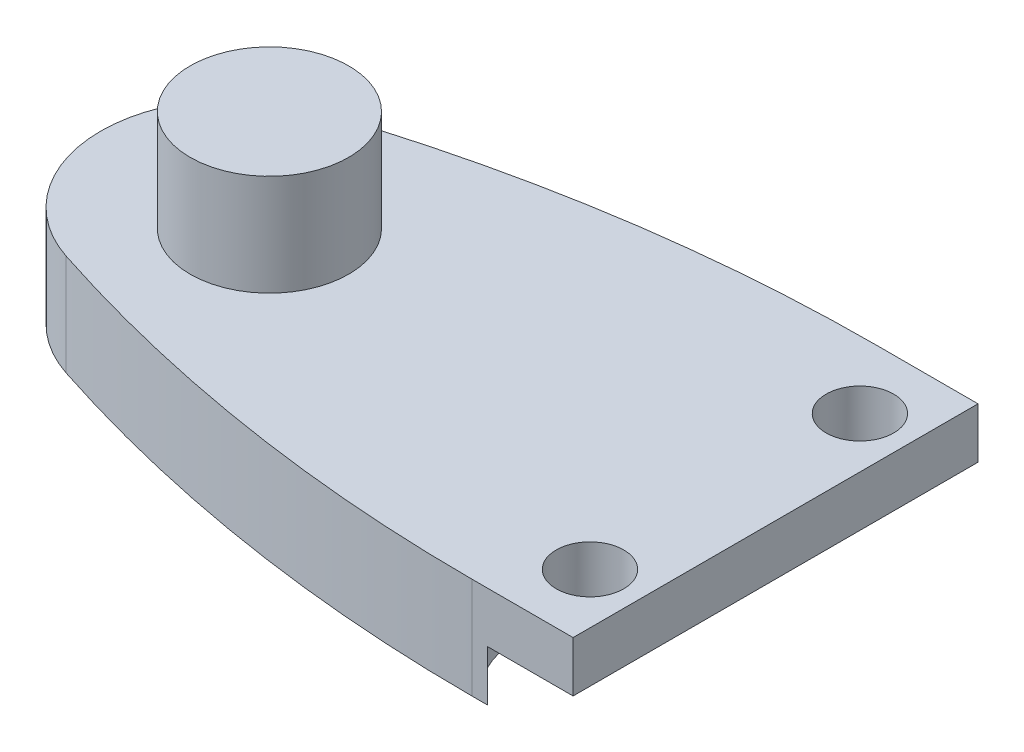
ISO-10303-21;
HEADER;
FILE_DESCRIPTION(('STEP AP214'),'2;1');
FILE_NAME('part.step','',(''),(''),'','','');
FILE_SCHEMA(('AUTOMOTIVE_DESIGN { 1 0 10303 214 1 1 1 1 }'));
ENDSEC;
DATA;
#1=APPLICATION_CONTEXT('core data for automotive mechanical design processes');
#2=APPLICATION_PROTOCOL_DEFINITION('international standard','automotive_design',2000,#1);
#3=PRODUCT_CONTEXT('',#1,'mechanical');
#4=PRODUCT('Part','Part','',(#3));
#5=PRODUCT_RELATED_PRODUCT_CATEGORY('part','',(#4));
#6=PRODUCT_DEFINITION_FORMATION('','',#4);
#7=PRODUCT_DEFINITION_CONTEXT('part definition',#1,'design');
#8=PRODUCT_DEFINITION('design','',#6,#7);
#9=PRODUCT_DEFINITION_SHAPE('','',#8);
#10=(LENGTH_UNIT() NAMED_UNIT(*) SI_UNIT(.MILLI.,.METRE.));
#11=(NAMED_UNIT(*) PLANE_ANGLE_UNIT() SI_UNIT($,.RADIAN.));
#12=(NAMED_UNIT(*) SI_UNIT($,.STERADIAN.) SOLID_ANGLE_UNIT());
#13=UNCERTAINTY_MEASURE_WITH_UNIT(LENGTH_MEASURE(1.E-05),#10,'distance_accuracy_value','');
#14=(GEOMETRIC_REPRESENTATION_CONTEXT(3) GLOBAL_UNCERTAINTY_ASSIGNED_CONTEXT((#13)) GLOBAL_UNIT_ASSIGNED_CONTEXT((#10,
#11,#12)) REPRESENTATION_CONTEXT('',''));
#15=CARTESIAN_POINT('',(0.,0.,0.));
#16=DIRECTION('',(0.,0.,1.));
#17=DIRECTION('',(1.,0.,0.));
#18=AXIS2_PLACEMENT_3D('',#15,#16,#17);
#19=CARTESIAN_POINT('',(15.,-3.,0.));
#20=DIRECTION('',(-1.,0.,0.));
#21=DIRECTION('',(0.,0.,1.));
#22=AXIS2_PLACEMENT_3D('',#19,#20,#21);
#23=PLANE('',#22);
#24=DIRECTION('',(0.,0.,1.));
#25=VECTOR('',#24,1.);
#26=CARTESIAN_POINT('',(15.,-1.5,0.));
#27=LINE('',#26,#25);
#28=CARTESIAN_POINT('',(15.,-1.5,-6.));
#29=VERTEX_POINT('',#28);
#30=CARTESIAN_POINT('',(15.,-1.5,6.));
#31=VERTEX_POINT('',#30);
#32=EDGE_CURVE('E154',#29,#31,#27,.T.);
#33=ORIENTED_EDGE('',*,*,#32,.F.);
#34=DIRECTION('',(0.,1.,0.));
#35=VECTOR('',#34,1.);
#36=CARTESIAN_POINT('',(15.,-3.,-6.));
#37=LINE('',#36,#35);
#38=CARTESIAN_POINT('',(15.,0.,-6.));
#39=VERTEX_POINT('',#38);
#40=EDGE_CURVE('E44',#29,#39,#37,.T.);
#41=ORIENTED_EDGE('',*,*,#40,.T.);
#42=DIRECTION('',(0.,0.,1.));
#43=VECTOR('',#42,1.);
#44=CARTESIAN_POINT('',(15.,0.,0.));
#45=LINE('',#44,#43);
#46=CARTESIAN_POINT('',(15.,0.,6.));
#47=VERTEX_POINT('',#46);
#48=EDGE_CURVE('E200',#39,#47,#45,.T.);
#49=ORIENTED_EDGE('',*,*,#48,.T.);
#50=DIRECTION('',(0.,1.,0.));
#51=VECTOR('',#50,1.);
#52=CARTESIAN_POINT('',(15.,-3.,6.));
#53=LINE('',#52,#51);
#54=EDGE_CURVE('E205',#31,#47,#53,.T.);
#55=ORIENTED_EDGE('',*,*,#54,.F.);
#56=EDGE_LOOP('',(#33,#41,#49,#55));
#57=FACE_BOUND('',#56,.T.);
#58=ADVANCED_FACE('F35',(#57),#23,.F.);
#59=CARTESIAN_POINT('',(13.5,-10.,4.));
#60=DIRECTION('',(0.,1.,0.));
#61=DIRECTION('',(0.,0.,1.));
#62=AXIS2_PLACEMENT_3D('',#59,#60,#61);
#63=CYLINDRICAL_SURFACE('',#62,1.);
#64=CARTESIAN_POINT('',(13.5,0.,4.));
#65=DIRECTION('',(0.,1.,0.));
#66=DIRECTION('',(0.,0.,1.));
#67=AXIS2_PLACEMENT_3D('',#64,#65,#66);
#68=CIRCLE('',#67,1.);
#69=CARTESIAN_POINT('',(13.5,0.,5.));
#70=VERTEX_POINT('',#69);
#71=EDGE_CURVE('E166',#70,#70,#68,.T.);
#72=ORIENTED_EDGE('',*,*,#71,.T.);
#73=EDGE_LOOP('',(#72));
#74=FACE_BOUND('',#73,.T.);
#75=CARTESIAN_POINT('',(13.5,-1.5,4.));
#76=DIRECTION('',(0.,-1.,0.));
#77=DIRECTION('',(0.,0.,-1.));
#78=AXIS2_PLACEMENT_3D('',#75,#76,#77);
#79=CIRCLE('',#78,1.);
#80=CARTESIAN_POINT('',(13.5,-1.5,3.));
#81=VERTEX_POINT('',#80);
#82=EDGE_CURVE('E150',#81,#81,#79,.F.);
#83=ORIENTED_EDGE('',*,*,#82,.F.);
#84=EDGE_LOOP('',(#83));
#85=FACE_BOUND('',#84,.T.);
#86=ADVANCED_FACE('F244',(#74,#85),#63,.F.);
#87=CARTESIAN_POINT('',(13.5,-10.,-4.));
#88=DIRECTION('',(0.,1.,0.));
#89=DIRECTION('',(0.,0.,1.));
#90=AXIS2_PLACEMENT_3D('',#87,#88,#89);
#91=CYLINDRICAL_SURFACE('',#90,1.);
#92=CARTESIAN_POINT('',(13.5,0.,-4.));
#93=DIRECTION('',(0.,1.,0.));
#94=DIRECTION('',(0.,0.,1.));
#95=AXIS2_PLACEMENT_3D('',#92,#93,#94);
#96=CIRCLE('',#95,1.);
#97=CARTESIAN_POINT('',(13.5,0.,-3.));
#98=VERTEX_POINT('',#97);
#99=EDGE_CURVE('E163',#98,#98,#96,.T.);
#100=ORIENTED_EDGE('',*,*,#99,.T.);
#101=EDGE_LOOP('',(#100));
#102=FACE_BOUND('',#101,.T.);
#103=CARTESIAN_POINT('',(13.5,-1.5,-4.));
#104=DIRECTION('',(0.,-1.,0.));
#105=DIRECTION('',(0.,0.,-1.));
#106=AXIS2_PLACEMENT_3D('',#103,#104,#105);
#107=CIRCLE('',#106,1.);
#108=CARTESIAN_POINT('',(13.5,-1.5,-5.));
#109=VERTEX_POINT('',#108);
#110=EDGE_CURVE('E39',#109,#109,#107,.F.);
#111=ORIENTED_EDGE('',*,*,#110,.F.);
#112=EDGE_LOOP('',(#111));
#113=FACE_BOUND('',#112,.T.);
#114=ADVANCED_FACE('F249',(#102,#113),#91,.F.);
#115=CARTESIAN_POINT('',(0.,0.,0.));
#116=DIRECTION('',(0.,1.,0.));
#117=DIRECTION('',(0.,0.,1.));
#118=AXIS2_PLACEMENT_3D('',#115,#116,#117);
#119=PLANE('',#118);
#120=ORIENTED_EDGE('',*,*,#99,.F.);
#121=EDGE_LOOP('',(#120));
#122=FACE_BOUND('',#121,.T.);
#123=ORIENTED_EDGE('',*,*,#71,.F.);
#124=EDGE_LOOP('',(#123));
#125=FACE_BOUND('',#124,.T.);
#126=CARTESIAN_POINT('',(12.,0.,40.0379964002251));
#127=DIRECTION('',(0.,1.,0.));
#128=DIRECTION('',(0.,0.,1.));
#129=AXIS2_PLACEMENT_3D('',#126,#127,#128);
#130=CIRCLE('',#129,46.0379964002251);
#131=CARTESIAN_POINT('',(12.,0.,-6.));
#132=VERTEX_POINT('',#131);
#133=CARTESIAN_POINT('',(-2.29999999999999,0.,-3.72279784013507));
#134=VERTEX_POINT('',#133);
#135=EDGE_CURVE('E173',#132,#134,#130,.T.);
#136=ORIENTED_EDGE('',*,*,#135,.T.);
#137=CARTESIAN_POINT('',(-1.08347708175661,0.,0.));
#138=DIRECTION('',(0.,1.,0.));
#139=DIRECTION('',(0.,0.,1.));
#140=AXIS2_PLACEMENT_3D('',#137,#138,#139);
#141=CIRCLE('',#140,3.91652291824339);
#142=CARTESIAN_POINT('',(-2.29999999999999,0.,3.72279784013507));
#143=VERTEX_POINT('',#142);
#144=EDGE_CURVE('E191',#134,#143,#141,.T.);
#145=ORIENTED_EDGE('',*,*,#144,.T.);
#146=CARTESIAN_POINT('',(12.,0.,-40.0379964002251));
#147=DIRECTION('',(0.,1.,0.));
#148=DIRECTION('',(0.,0.,1.));
#149=AXIS2_PLACEMENT_3D('',#146,#147,#148);
#150=CIRCLE('',#149,46.0379964002251);
#151=CARTESIAN_POINT('',(12.,0.,6.));
#152=VERTEX_POINT('',#151);
#153=EDGE_CURVE('E194',#152,#143,#150,.F.);
#154=ORIENTED_EDGE('',*,*,#153,.F.);
#155=DIRECTION('',(1.,0.,0.));
#156=VECTOR('',#155,1.);
#157=CARTESIAN_POINT('',(0.,0.,6.));
#158=LINE('',#157,#156);
#159=EDGE_CURVE('E197',#152,#47,#158,.T.);
#160=ORIENTED_EDGE('',*,*,#159,.T.);
#161=ORIENTED_EDGE('',*,*,#48,.F.);
#162=DIRECTION('',(1.,0.,0.));
#163=VECTOR('',#162,1.);
#164=CARTESIAN_POINT('',(0.,0.,-6.));
#165=LINE('',#164,#163);
#166=EDGE_CURVE('E179',#132,#39,#165,.T.);
#167=ORIENTED_EDGE('',*,*,#166,.F.);
#168=EDGE_LOOP('',(#136,#145,#154,#160,#161,#167));
#169=FACE_BOUND('',#168,.T.);
#170=CARTESIAN_POINT('',(0.,0.,0.));
#171=DIRECTION('',(0.,1.,0.));
#172=DIRECTION('',(0.,0.,1.));
#173=AXIS2_PLACEMENT_3D('',#170,#171,#172);
#174=CIRCLE('',#173,2.35);
#175=CARTESIAN_POINT('',(0.,0.,2.35));
#176=VERTEX_POINT('',#175);
#177=EDGE_CURVE('E169',#176,#176,#174,.T.);
#178=ORIENTED_EDGE('',*,*,#177,.F.);
#179=EDGE_LOOP('',(#178));
#180=FACE_BOUND('',#179,.T.);
#181=ADVANCED_FACE('F215',(#122,#125,#169,#180),#119,.T.);
#182=CARTESIAN_POINT('',(12.,-3.,40.0379964002251));
#183=DIRECTION('',(0.,1.,0.));
#184=DIRECTION('',(0.,0.,1.));
#185=AXIS2_PLACEMENT_3D('',#182,#183,#184);
#186=CYLINDRICAL_SURFACE('',#185,46.0379964002251);
#187=ORIENTED_EDGE('',*,*,#135,.F.);
#188=DIRECTION('',(0.,1.,0.));
#189=VECTOR('',#188,1.);
#190=CARTESIAN_POINT('',(12.,-3.,-6.));
#191=LINE('',#190,#189);
#192=CARTESIAN_POINT('',(12.,-3.,-6.));
#193=VERTEX_POINT('',#192);
#194=EDGE_CURVE('E11',#193,#132,#191,.T.);
#195=ORIENTED_EDGE('',*,*,#194,.F.);
#196=CARTESIAN_POINT('',(12.,-3.,40.0379964002251));
#197=DIRECTION('',(0.,1.,0.));
#198=DIRECTION('',(0.,0.,1.));
#199=AXIS2_PLACEMENT_3D('',#196,#197,#198);
#200=CIRCLE('',#199,46.0379964002251);
#201=CARTESIAN_POINT('',(-2.29999999999999,-3.,-3.72279784013507));
#202=VERTEX_POINT('',#201);
#203=EDGE_CURVE('E176',#193,#202,#200,.T.);
#204=ORIENTED_EDGE('',*,*,#203,.T.);
#205=DIRECTION('',(0.,1.,0.));
#206=VECTOR('',#205,1.);
#207=CARTESIAN_POINT('',(-2.29999999999999,-3.,-3.72279784013507));
#208=LINE('',#207,#206);
#209=EDGE_CURVE('E91',#202,#134,#208,.T.);
#210=ORIENTED_EDGE('',*,*,#209,.T.);
#211=EDGE_LOOP('',(#187,#195,#204,#210));
#212=FACE_BOUND('',#211,.T.);
#213=ADVANCED_FACE('F37',(#212),#186,.T.);
#214=CARTESIAN_POINT('',(0.,-3.,-6.));
#215=DIRECTION('',(0.,0.,1.));
#216=DIRECTION('',(1.,0.,0.));
#217=AXIS2_PLACEMENT_3D('',#214,#215,#216);
#218=PLANE('',#217);
#219=DIRECTION('',(1.,0.,0.));
#220=VECTOR('',#219,1.);
#221=CARTESIAN_POINT('',(0.,-1.5,-6.));
#222=LINE('',#221,#220);
#223=CARTESIAN_POINT('',(12.4692235935956,-1.5,-6.));
#224=VERTEX_POINT('',#223);
#225=EDGE_CURVE('E156',#224,#29,#222,.T.);
#226=ORIENTED_EDGE('',*,*,#225,.F.);
#227=DIRECTION('',(0.,-1.,0.));
#228=VECTOR('',#227,1.);
#229=CARTESIAN_POINT('',(12.4692235935956,-1.5,-6.));
#230=LINE('',#229,#228);
#231=CARTESIAN_POINT('',(12.4692235935956,-3.,-6.));
#232=VERTEX_POINT('',#231);
#233=EDGE_CURVE('E158',#224,#232,#230,.T.);
#234=ORIENTED_EDGE('',*,*,#233,.T.);
#235=DIRECTION('',(1.,0.,0.));
#236=VECTOR('',#235,1.);
#237=CARTESIAN_POINT('',(0.,-3.,-6.));
#238=LINE('',#237,#236);
#239=EDGE_CURVE('E186',#193,#232,#238,.T.);
#240=ORIENTED_EDGE('',*,*,#239,.F.);
#241=ORIENTED_EDGE('',*,*,#194,.T.);
#242=ORIENTED_EDGE('',*,*,#166,.T.);
#243=ORIENTED_EDGE('',*,*,#40,.F.);
#244=EDGE_LOOP('',(#226,#234,#240,#241,#242,#243));
#245=FACE_BOUND('',#244,.T.);
#246=ADVANCED_FACE('F220',(#245),#218,.F.);
#247=CARTESIAN_POINT('',(0.,-3.,6.));
#248=DIRECTION('',(0.,0.,1.));
#249=DIRECTION('',(1.,0.,0.));
#250=AXIS2_PLACEMENT_3D('',#247,#248,#249);
#251=PLANE('',#250);
#252=DIRECTION('',(0.,-1.,0.));
#253=VECTOR('',#252,1.);
#254=CARTESIAN_POINT('',(12.4692235935956,-1.5,6.));
#255=LINE('',#254,#253);
#256=CARTESIAN_POINT('',(12.4692235935956,-1.5,6.));
#257=VERTEX_POINT('',#256);
#258=CARTESIAN_POINT('',(12.4692235935956,-3.,6.));
#259=VERTEX_POINT('',#258);
#260=EDGE_CURVE('E161',#257,#259,#255,.T.);
#261=ORIENTED_EDGE('',*,*,#260,.F.);
#262=DIRECTION('',(1.,0.,0.));
#263=VECTOR('',#262,1.);
#264=CARTESIAN_POINT('',(0.,-1.5,6.));
#265=LINE('',#264,#263);
#266=EDGE_CURVE('E128',#257,#31,#265,.T.);
#267=ORIENTED_EDGE('',*,*,#266,.T.);
#268=ORIENTED_EDGE('',*,*,#54,.T.);
#269=ORIENTED_EDGE('',*,*,#159,.F.);
#270=DIRECTION('',(0.,1.,0.));
#271=VECTOR('',#270,1.);
#272=CARTESIAN_POINT('',(12.,-3.,6.));
#273=LINE('',#272,#271);
#274=CARTESIAN_POINT('',(12.,-3.,6.));
#275=VERTEX_POINT('',#274);
#276=EDGE_CURVE('E207',#275,#152,#273,.T.);
#277=ORIENTED_EDGE('',*,*,#276,.F.);
#278=DIRECTION('',(1.,0.,0.));
#279=VECTOR('',#278,1.);
#280=CARTESIAN_POINT('',(0.,-3.,6.));
#281=LINE('',#280,#279);
#282=EDGE_CURVE('E183',#275,#259,#281,.T.);
#283=ORIENTED_EDGE('',*,*,#282,.T.);
#284=EDGE_LOOP('',(#261,#267,#268,#269,#277,#283));
#285=FACE_BOUND('',#284,.T.);
#286=ADVANCED_FACE('F225',(#285),#251,.T.);
#287=CARTESIAN_POINT('',(12.,-3.,-40.0379964002251));
#288=DIRECTION('',(0.,1.,0.));
#289=DIRECTION('',(0.,0.,1.));
#290=AXIS2_PLACEMENT_3D('',#287,#288,#289);
#291=CYLINDRICAL_SURFACE('',#290,46.0379964002251);
#292=ORIENTED_EDGE('',*,*,#153,.T.);
#293=DIRECTION('',(0.,1.,0.));
#294=VECTOR('',#293,1.);
#295=CARTESIAN_POINT('',(-2.29999999999999,-3.,3.72279784013507));
#296=LINE('',#295,#294);
#297=CARTESIAN_POINT('',(-2.29999999999999,-3.,3.72279784013507));
#298=VERTEX_POINT('',#297);
#299=EDGE_CURVE('E209',#298,#143,#296,.T.);
#300=ORIENTED_EDGE('',*,*,#299,.F.);
#301=CARTESIAN_POINT('',(12.,-3.,-40.0379964002251));
#302=DIRECTION('',(0.,1.,0.));
#303=DIRECTION('',(0.,0.,1.));
#304=AXIS2_PLACEMENT_3D('',#301,#302,#303);
#305=CIRCLE('',#304,46.0379964002251);
#306=EDGE_CURVE('E181',#275,#298,#305,.F.);
#307=ORIENTED_EDGE('',*,*,#306,.F.);
#308=ORIENTED_EDGE('',*,*,#276,.T.);
#309=EDGE_LOOP('',(#292,#300,#307,#308));
#310=FACE_BOUND('',#309,.T.);
#311=ADVANCED_FACE('F235',(#310),#291,.T.);
#312=CARTESIAN_POINT('',(-1.08347708175661,-3.,0.));
#313=DIRECTION('',(0.,1.,0.));
#314=DIRECTION('',(0.,0.,1.));
#315=AXIS2_PLACEMENT_3D('',#312,#313,#314);
#316=CYLINDRICAL_SURFACE('',#315,3.91652291824339);
#317=ORIENTED_EDGE('',*,*,#144,.F.);
#318=ORIENTED_EDGE('',*,*,#209,.F.);
#319=CARTESIAN_POINT('',(-1.08347708175661,-3.,0.));
#320=DIRECTION('',(0.,1.,0.));
#321=DIRECTION('',(0.,0.,1.));
#322=AXIS2_PLACEMENT_3D('',#319,#320,#321);
#323=CIRCLE('',#322,3.91652291824339);
#324=EDGE_CURVE('E178',#202,#298,#323,.T.);
#325=ORIENTED_EDGE('',*,*,#324,.T.);
#326=ORIENTED_EDGE('',*,*,#299,.T.);
#327=EDGE_LOOP('',(#317,#318,#325,#326));
#328=FACE_BOUND('',#327,.T.);
#329=ADVANCED_FACE('F211',(#328),#316,.T.);
#330=CARTESIAN_POINT('',(0.,-3.,0.));
#331=DIRECTION('',(0.,1.,0.));
#332=DIRECTION('',(0.,0.,1.));
#333=AXIS2_PLACEMENT_3D('',#330,#331,#332);
#334=PLANE('',#333);
#335=DIRECTION('',(0.,0.,-1.));
#336=VECTOR('',#335,1.);
#337=CARTESIAN_POINT('',(13.5,-3.,1.75));
#338=LINE('',#337,#336);
#339=CARTESIAN_POINT('',(13.5,-3.,1.75));
#340=VERTEX_POINT('',#339);
#341=CARTESIAN_POINT('',(13.5,-3.,-1.75));
#342=VERTEX_POINT('',#341);
#343=EDGE_CURVE('E146',#340,#342,#338,.T.);
#344=ORIENTED_EDGE('',*,*,#343,.F.);
#345=CARTESIAN_POINT('',(13.5,-3.,4.));
#346=DIRECTION('',(0.,-1.,0.));
#347=DIRECTION('',(0.,0.,-1.));
#348=AXIS2_PLACEMENT_3D('',#345,#346,#347);
#349=CIRCLE('',#348,2.25);
#350=EDGE_CURVE('E135',#259,#340,#349,.T.);
#351=ORIENTED_EDGE('',*,*,#350,.F.);
#352=ORIENTED_EDGE('',*,*,#282,.F.);
#353=ORIENTED_EDGE('',*,*,#306,.T.);
#354=ORIENTED_EDGE('',*,*,#324,.F.);
#355=ORIENTED_EDGE('',*,*,#203,.F.);
#356=ORIENTED_EDGE('',*,*,#239,.T.);
#357=CARTESIAN_POINT('',(13.5,-3.,-4.));
#358=DIRECTION('',(0.,-1.,0.));
#359=DIRECTION('',(0.,0.,-1.));
#360=AXIS2_PLACEMENT_3D('',#357,#358,#359);
#361=CIRCLE('',#360,2.25);
#362=EDGE_CURVE('E131',#342,#232,#361,.T.);
#363=ORIENTED_EDGE('',*,*,#362,.F.);
#364=EDGE_LOOP('',(#344,#351,#352,#353,#354,#355,#356,#363));
#365=FACE_BOUND('',#364,.T.);
#366=ADVANCED_FACE('F229',(#365),#334,.F.);
#367=CARTESIAN_POINT('',(0.,3.,0.));
#368=DIRECTION('',(0.,-1.,0.));
#369=DIRECTION('',(0.,0.,-1.));
#370=AXIS2_PLACEMENT_3D('',#367,#368,#369);
#371=CYLINDRICAL_SURFACE('',#370,2.35);
#372=CARTESIAN_POINT('',(0.,3.,0.));
#373=DIRECTION('',(0.,1.,0.));
#374=DIRECTION('',(0.,0.,1.));
#375=AXIS2_PLACEMENT_3D('',#372,#373,#374);
#376=CIRCLE('',#375,2.35);
#377=CARTESIAN_POINT('',(0.,3.,2.35));
#378=VERTEX_POINT('',#377);
#379=EDGE_CURVE('E170',#378,#378,#376,.T.);
#380=ORIENTED_EDGE('',*,*,#379,.F.);
#381=EDGE_LOOP('',(#380));
#382=FACE_BOUND('',#381,.T.);
#383=ORIENTED_EDGE('',*,*,#177,.T.);
#384=EDGE_LOOP('',(#383));
#385=FACE_BOUND('',#384,.T.);
#386=ADVANCED_FACE('F260',(#382,#385),#371,.T.);
#387=CARTESIAN_POINT('',(0.,3.,0.));
#388=DIRECTION('',(0.,1.,0.));
#389=DIRECTION('',(0.,0.,1.));
#390=AXIS2_PLACEMENT_3D('',#387,#388,#389);
#391=PLANE('',#390);
#392=ORIENTED_EDGE('',*,*,#379,.T.);
#393=EDGE_LOOP('',(#392));
#394=FACE_BOUND('',#393,.T.);
#395=ADVANCED_FACE('F263',(#394),#391,.T.);
#396=CARTESIAN_POINT('',(13.5,-1.5,-4.));
#397=DIRECTION('',(0.,-1.,0.));
#398=DIRECTION('',(0.,0.,-1.));
#399=AXIS2_PLACEMENT_3D('',#396,#397,#398);
#400=CYLINDRICAL_SURFACE('',#399,2.25);
#401=CARTESIAN_POINT('',(13.5,-1.5,-4.));
#402=DIRECTION('',(0.,-1.,0.));
#403=DIRECTION('',(0.,0.,-1.));
#404=AXIS2_PLACEMENT_3D('',#401,#402,#403);
#405=CIRCLE('',#404,2.25);
#406=CARTESIAN_POINT('',(13.5,-1.5,-1.75));
#407=VERTEX_POINT('',#406);
#408=EDGE_CURVE('E138',#407,#224,#405,.T.);
#409=ORIENTED_EDGE('',*,*,#408,.F.);
#410=DIRECTION('',(0.,-1.,0.));
#411=VECTOR('',#410,1.);
#412=CARTESIAN_POINT('',(13.5,-1.5,-1.75));
#413=LINE('',#412,#411);
#414=EDGE_CURVE('E137',#407,#342,#413,.T.);
#415=ORIENTED_EDGE('',*,*,#414,.T.);
#416=ORIENTED_EDGE('',*,*,#362,.T.);
#417=ORIENTED_EDGE('',*,*,#233,.F.);
#418=EDGE_LOOP('',(#409,#415,#416,#417));
#419=FACE_BOUND('',#418,.T.);
#420=ADVANCED_FACE('F232',(#419),#400,.F.);
#421=CARTESIAN_POINT('',(13.5,-1.5,4.));
#422=DIRECTION('',(0.,-1.,0.));
#423=DIRECTION('',(0.,0.,-1.));
#424=AXIS2_PLACEMENT_3D('',#421,#422,#423);
#425=PLANE('',#424);
#426=ORIENTED_EDGE('',*,*,#82,.T.);
#427=EDGE_LOOP('',(#426));
#428=FACE_BOUND('',#427,.T.);
#429=ORIENTED_EDGE('',*,*,#110,.T.);
#430=EDGE_LOOP('',(#429));
#431=FACE_BOUND('',#430,.T.);
#432=ORIENTED_EDGE('',*,*,#225,.T.);
#433=ORIENTED_EDGE('',*,*,#32,.T.);
#434=ORIENTED_EDGE('',*,*,#266,.F.);
#435=CARTESIAN_POINT('',(13.5,-1.5,4.));
#436=DIRECTION('',(0.,-1.,0.));
#437=DIRECTION('',(0.,0.,-1.));
#438=AXIS2_PLACEMENT_3D('',#435,#436,#437);
#439=CIRCLE('',#438,2.25);
#440=CARTESIAN_POINT('',(13.5,-1.5,1.75));
#441=VERTEX_POINT('',#440);
#442=EDGE_CURVE('E123',#257,#441,#439,.T.);
#443=ORIENTED_EDGE('',*,*,#442,.T.);
#444=DIRECTION('',(0.,0.,-1.));
#445=VECTOR('',#444,1.);
#446=CARTESIAN_POINT('',(13.5,-1.5,1.75));
#447=LINE('',#446,#445);
#448=EDGE_CURVE('E126',#441,#407,#447,.T.);
#449=ORIENTED_EDGE('',*,*,#448,.T.);
#450=ORIENTED_EDGE('',*,*,#408,.T.);
#451=EDGE_LOOP('',(#432,#433,#434,#443,#449,#450));
#452=FACE_BOUND('',#451,.T.);
#453=ADVANCED_FACE('F124',(#428,#431,#452),#425,.T.);
#454=CARTESIAN_POINT('',(13.5,-1.5,4.));
#455=DIRECTION('',(0.,-1.,0.));
#456=DIRECTION('',(0.,0.,-1.));
#457=AXIS2_PLACEMENT_3D('',#454,#455,#456);
#458=CYLINDRICAL_SURFACE('',#457,2.25);
#459=ORIENTED_EDGE('',*,*,#260,.T.);
#460=ORIENTED_EDGE('',*,*,#350,.T.);
#461=DIRECTION('',(0.,-1.,0.));
#462=VECTOR('',#461,1.);
#463=CARTESIAN_POINT('',(13.5,-1.5,1.75));
#464=LINE('',#463,#462);
#465=EDGE_CURVE('E52',#441,#340,#464,.T.);
#466=ORIENTED_EDGE('',*,*,#465,.F.);
#467=ORIENTED_EDGE('',*,*,#442,.F.);
#468=EDGE_LOOP('',(#459,#460,#466,#467));
#469=FACE_BOUND('',#468,.T.);
#470=ADVANCED_FACE('F133',(#469),#458,.F.);
#471=CARTESIAN_POINT('',(13.5,-1.5,1.75));
#472=DIRECTION('',(-1.,0.,0.));
#473=DIRECTION('',(0.,0.,1.));
#474=AXIS2_PLACEMENT_3D('',#471,#472,#473);
#475=PLANE('',#474);
#476=ORIENTED_EDGE('',*,*,#343,.T.);
#477=ORIENTED_EDGE('',*,*,#414,.F.);
#478=ORIENTED_EDGE('',*,*,#448,.F.);
#479=ORIENTED_EDGE('',*,*,#465,.T.);
#480=EDGE_LOOP('',(#476,#477,#478,#479));
#481=FACE_BOUND('',#480,.T.);
#482=ADVANCED_FACE('F140',(#481),#475,.F.);
#483=CLOSED_SHELL('',(#58,#86,#114,#181,#213,#246,#286,#311,#329,#366,#386,#395,#420,#453,#470,#482));
#484=MANIFOLD_SOLID_BREP('B2',#483);
#485=ADVANCED_BREP_SHAPE_REPRESENTATION('',(#18,#484),#14);
#486=SHAPE_DEFINITION_REPRESENTATION(#9,#485);
ENDSEC;
END-ISO-10303-21;
